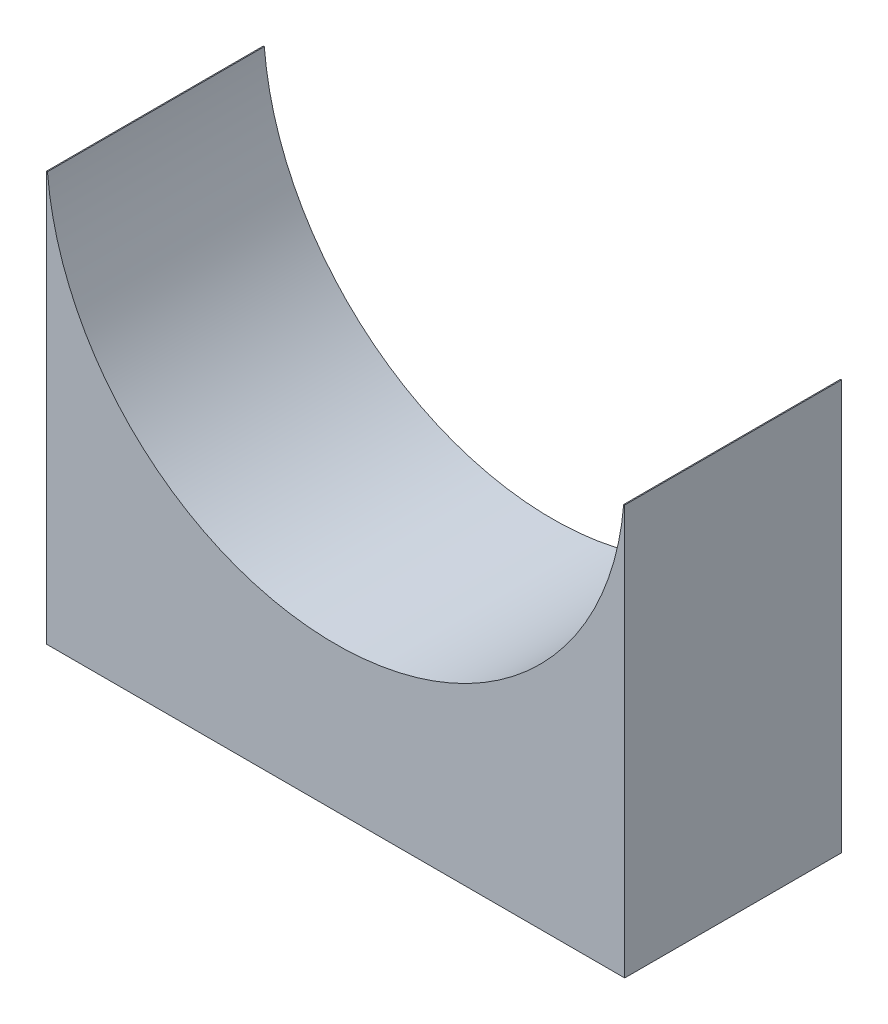
ISO-10303-21;
HEADER;
FILE_DESCRIPTION(('STEP AP214'),'2;1');
FILE_NAME('part.step','',(''),(''),'','','');
FILE_SCHEMA(('AUTOMOTIVE_DESIGN { 1 0 10303 214 1 1 1 1 }'));
ENDSEC;
DATA;
#1=APPLICATION_CONTEXT('core data for automotive mechanical design processes');
#2=APPLICATION_PROTOCOL_DEFINITION('international standard','automotive_design',2000,#1);
#3=PRODUCT_CONTEXT('',#1,'mechanical');
#4=PRODUCT('Part','Part','',(#3));
#5=PRODUCT_RELATED_PRODUCT_CATEGORY('part','',(#4));
#6=PRODUCT_DEFINITION_FORMATION('','',#4);
#7=PRODUCT_DEFINITION_CONTEXT('part definition',#1,'design');
#8=PRODUCT_DEFINITION('design','',#6,#7);
#9=PRODUCT_DEFINITION_SHAPE('','',#8);
#10=(LENGTH_UNIT() NAMED_UNIT(*) SI_UNIT(.MILLI.,.METRE.));
#11=(NAMED_UNIT(*) PLANE_ANGLE_UNIT() SI_UNIT($,.RADIAN.));
#12=(NAMED_UNIT(*) SI_UNIT($,.STERADIAN.) SOLID_ANGLE_UNIT());
#13=UNCERTAINTY_MEASURE_WITH_UNIT(LENGTH_MEASURE(1.E-05),#10,'distance_accuracy_value','');
#14=(GEOMETRIC_REPRESENTATION_CONTEXT(3) GLOBAL_UNCERTAINTY_ASSIGNED_CONTEXT((#13)) GLOBAL_UNIT_ASSIGNED_CONTEXT((#10,
#11,#12)) REPRESENTATION_CONTEXT('',''));
#15=CARTESIAN_POINT('',(0.,0.,0.));
#16=DIRECTION('',(0.,0.,1.));
#17=DIRECTION('',(1.,0.,0.));
#18=AXIS2_PLACEMENT_3D('',#15,#16,#17);
#19=CARTESIAN_POINT('',(0.,0.,4.5));
#20=DIRECTION('',(0.,0.,-1.));
#21=DIRECTION('',(-1.,0.,0.));
#22=AXIS2_PLACEMENT_3D('',#19,#20,#21);
#23=CYLINDRICAL_SURFACE('',#22,6.);
#24=CARTESIAN_POINT('',(0.,0.,0.));
#25=DIRECTION('',(0.,0.,1.));
#26=DIRECTION('',(1.,0.,0.));
#27=AXIS2_PLACEMENT_3D('',#24,#25,#26);
#28=CIRCLE('',#27,6.);
#29=CARTESIAN_POINT('',(-5.9791303715507,-0.5,0.));
#30=VERTEX_POINT('',#29);
#31=CARTESIAN_POINT('',(5.9791303715507,-0.5,0.));
#32=VERTEX_POINT('',#31);
#33=EDGE_CURVE('E117',#30,#32,#28,.T.);
#34=ORIENTED_EDGE('',*,*,#33,.F.);
#35=DIRECTION('',(0.,0.,-1.));
#36=VECTOR('',#35,1.);
#37=CARTESIAN_POINT('',(-5.9791303715507,-0.5,4.5));
#38=LINE('',#37,#36);
#39=CARTESIAN_POINT('',(-5.9791303715507,-0.5,4.5));
#40=VERTEX_POINT('',#39);
#41=EDGE_CURVE('E11',#40,#30,#38,.T.);
#42=ORIENTED_EDGE('',*,*,#41,.F.);
#43=CARTESIAN_POINT('',(0.,0.,4.5));
#44=DIRECTION('',(0.,0.,1.));
#45=DIRECTION('',(1.,0.,0.));
#46=AXIS2_PLACEMENT_3D('',#43,#44,#45);
#47=CIRCLE('',#46,6.);
#48=CARTESIAN_POINT('',(5.9791303715507,-0.5,4.5));
#49=VERTEX_POINT('',#48);
#50=EDGE_CURVE('E130',#40,#49,#47,.T.);
#51=ORIENTED_EDGE('',*,*,#50,.T.);
#52=DIRECTION('',(0.,0.,-1.));
#53=VECTOR('',#52,1.);
#54=CARTESIAN_POINT('',(5.9791303715507,-0.5,4.5));
#55=LINE('',#54,#53);
#56=EDGE_CURVE('E51',#49,#32,#55,.T.);
#57=ORIENTED_EDGE('',*,*,#56,.T.);
#58=EDGE_LOOP('',(#34,#42,#51,#57));
#59=FACE_BOUND('',#58,.T.);
#60=ADVANCED_FACE('F35',(#59),#23,.F.);
#61=CARTESIAN_POINT('',(0.,-0.499999999999627,4.5));
#62=DIRECTION('',(0.,1.,0.));
#63=DIRECTION('',(-1.,0.,0.));
#64=AXIS2_PLACEMENT_3D('',#61,#62,#63);
#65=PLANE('',#64);
#66=DIRECTION('',(1.,0.,0.));
#67=VECTOR('',#66,1.);
#68=CARTESIAN_POINT('',(0.,-0.499999999999627,0.));
#69=LINE('',#68,#67);
#70=CARTESIAN_POINT('',(-6.,-0.500000000000001,0.));
#71=VERTEX_POINT('',#70);
#72=EDGE_CURVE('E119',#71,#30,#69,.T.);
#73=ORIENTED_EDGE('',*,*,#72,.F.);
#74=DIRECTION('',(0.,0.,-1.));
#75=VECTOR('',#74,1.);
#76=CARTESIAN_POINT('',(-6.,-0.500000000000001,4.5));
#77=LINE('',#76,#75);
#78=CARTESIAN_POINT('',(-6.,-0.500000000000001,4.5));
#79=VERTEX_POINT('',#78);
#80=EDGE_CURVE('E43',#79,#71,#77,.T.);
#81=ORIENTED_EDGE('',*,*,#80,.F.);
#82=DIRECTION('',(1.,0.,0.));
#83=VECTOR('',#82,1.);
#84=CARTESIAN_POINT('',(0.,-0.499999999999627,4.5));
#85=LINE('',#84,#83);
#86=EDGE_CURVE('E142',#79,#40,#85,.T.);
#87=ORIENTED_EDGE('',*,*,#86,.T.);
#88=ORIENTED_EDGE('',*,*,#41,.T.);
#89=EDGE_LOOP('',(#73,#81,#87,#88));
#90=FACE_BOUND('',#89,.T.);
#91=ADVANCED_FACE('F141',(#90),#65,.T.);
#92=CARTESIAN_POINT('',(-6.,0.,4.5));
#93=DIRECTION('',(1.,0.,0.));
#94=DIRECTION('',(0.,1.,0.));
#95=AXIS2_PLACEMENT_3D('',#92,#93,#94);
#96=PLANE('',#95);
#97=DIRECTION('',(0.,-1.,0.));
#98=VECTOR('',#97,1.);
#99=CARTESIAN_POINT('',(-6.,0.,0.));
#100=LINE('',#99,#98);
#101=CARTESIAN_POINT('',(-6.,-9.,0.));
#102=VERTEX_POINT('',#101);
#103=EDGE_CURVE('E122',#71,#102,#100,.T.);
#104=ORIENTED_EDGE('',*,*,#103,.T.);
#105=DIRECTION('',(0.,0.,-1.));
#106=VECTOR('',#105,1.);
#107=CARTESIAN_POINT('',(-6.,-9.,4.5));
#108=LINE('',#107,#106);
#109=CARTESIAN_POINT('',(-6.,-9.,4.5));
#110=VERTEX_POINT('',#109);
#111=EDGE_CURVE('E109',#110,#102,#108,.T.);
#112=ORIENTED_EDGE('',*,*,#111,.F.);
#113=DIRECTION('',(0.,-1.,0.));
#114=VECTOR('',#113,1.);
#115=CARTESIAN_POINT('',(-6.,0.,4.5));
#116=LINE('',#115,#114);
#117=EDGE_CURVE('E97',#79,#110,#116,.T.);
#118=ORIENTED_EDGE('',*,*,#117,.F.);
#119=ORIENTED_EDGE('',*,*,#80,.T.);
#120=EDGE_LOOP('',(#104,#112,#118,#119));
#121=FACE_BOUND('',#120,.T.);
#122=ADVANCED_FACE('F135',(#121),#96,.F.);
#123=CARTESIAN_POINT('',(0.,-9.,4.5));
#124=DIRECTION('',(0.,1.,0.));
#125=DIRECTION('',(0.,0.,1.));
#126=AXIS2_PLACEMENT_3D('',#123,#124,#125);
#127=PLANE('',#126);
#128=DIRECTION('',(1.,0.,0.));
#129=VECTOR('',#128,1.);
#130=CARTESIAN_POINT('',(0.,-9.,0.));
#131=LINE('',#130,#129);
#132=CARTESIAN_POINT('',(6.,-9.,0.));
#133=VERTEX_POINT('',#132);
#134=EDGE_CURVE('E106',#102,#133,#131,.T.);
#135=ORIENTED_EDGE('',*,*,#134,.T.);
#136=DIRECTION('',(0.,0.,-1.));
#137=VECTOR('',#136,1.);
#138=CARTESIAN_POINT('',(6.,-9.,4.5));
#139=LINE('',#138,#137);
#140=CARTESIAN_POINT('',(6.,-9.,4.5));
#141=VERTEX_POINT('',#140);
#142=EDGE_CURVE('E103',#141,#133,#139,.T.);
#143=ORIENTED_EDGE('',*,*,#142,.F.);
#144=DIRECTION('',(1.,0.,0.));
#145=VECTOR('',#144,1.);
#146=CARTESIAN_POINT('',(0.,-9.,4.5));
#147=LINE('',#146,#145);
#148=EDGE_CURVE('E89',#110,#141,#147,.T.);
#149=ORIENTED_EDGE('',*,*,#148,.F.);
#150=ORIENTED_EDGE('',*,*,#111,.T.);
#151=EDGE_LOOP('',(#135,#143,#149,#150));
#152=FACE_BOUND('',#151,.T.);
#153=ADVANCED_FACE('F104',(#152),#127,.F.);
#154=CARTESIAN_POINT('',(6.,0.,4.5));
#155=DIRECTION('',(1.,0.,0.));
#156=DIRECTION('',(0.,1.,0.));
#157=AXIS2_PLACEMENT_3D('',#154,#155,#156);
#158=PLANE('',#157);
#159=DIRECTION('',(0.,-1.,0.));
#160=VECTOR('',#159,1.);
#161=CARTESIAN_POINT('',(6.,0.,0.));
#162=LINE('',#161,#160);
#163=CARTESIAN_POINT('',(6.,-0.499999999999999,0.));
#164=VERTEX_POINT('',#163);
#165=EDGE_CURVE('E125',#164,#133,#162,.T.);
#166=ORIENTED_EDGE('',*,*,#165,.F.);
#167=DIRECTION('',(0.,0.,-1.));
#168=VECTOR('',#167,1.);
#169=CARTESIAN_POINT('',(6.,-0.499999999999999,4.5));
#170=LINE('',#169,#168);
#171=CARTESIAN_POINT('',(6.,-0.499999999999999,4.5));
#172=VERTEX_POINT('',#171);
#173=EDGE_CURVE('E70',#172,#164,#170,.T.);
#174=ORIENTED_EDGE('',*,*,#173,.F.);
#175=DIRECTION('',(0.,-1.,0.));
#176=VECTOR('',#175,1.);
#177=CARTESIAN_POINT('',(6.,0.,4.5));
#178=LINE('',#177,#176);
#179=EDGE_CURVE('E94',#172,#141,#178,.T.);
#180=ORIENTED_EDGE('',*,*,#179,.T.);
#181=ORIENTED_EDGE('',*,*,#142,.T.);
#182=EDGE_LOOP('',(#166,#174,#180,#181));
#183=FACE_BOUND('',#182,.T.);
#184=ADVANCED_FACE('F111',(#183),#158,.T.);
#185=CARTESIAN_POINT('',(0.,-0.500000000000466,4.5));
#186=DIRECTION('',(0.,1.,0.));
#187=DIRECTION('',(-1.,0.,0.));
#188=AXIS2_PLACEMENT_3D('',#185,#186,#187);
#189=PLANE('',#188);
#190=DIRECTION('',(1.,0.,0.));
#191=VECTOR('',#190,1.);
#192=CARTESIAN_POINT('',(0.,-0.500000000000466,0.));
#193=LINE('',#192,#191);
#194=EDGE_CURVE('E127',#32,#164,#193,.T.);
#195=ORIENTED_EDGE('',*,*,#194,.F.);
#196=ORIENTED_EDGE('',*,*,#56,.F.);
#197=DIRECTION('',(1.,0.,0.));
#198=VECTOR('',#197,1.);
#199=CARTESIAN_POINT('',(0.,-0.500000000000466,4.5));
#200=LINE('',#199,#198);
#201=EDGE_CURVE('E112',#49,#172,#200,.T.);
#202=ORIENTED_EDGE('',*,*,#201,.T.);
#203=ORIENTED_EDGE('',*,*,#173,.T.);
#204=EDGE_LOOP('',(#195,#196,#202,#203));
#205=FACE_BOUND('',#204,.T.);
#206=ADVANCED_FACE('F143',(#205),#189,.T.);
#207=CARTESIAN_POINT('',(0.,0.,4.5));
#208=DIRECTION('',(0.,0.,1.));
#209=DIRECTION('',(1.,0.,0.));
#210=AXIS2_PLACEMENT_3D('',#207,#208,#209);
#211=PLANE('',#210);
#212=ORIENTED_EDGE('',*,*,#50,.F.);
#213=ORIENTED_EDGE('',*,*,#86,.F.);
#214=ORIENTED_EDGE('',*,*,#117,.T.);
#215=ORIENTED_EDGE('',*,*,#148,.T.);
#216=ORIENTED_EDGE('',*,*,#179,.F.);
#217=ORIENTED_EDGE('',*,*,#201,.F.);
#218=EDGE_LOOP('',(#212,#213,#214,#215,#216,#217));
#219=FACE_BOUND('',#218,.T.);
#220=ADVANCED_FACE('F91',(#219),#211,.T.);
#221=CARTESIAN_POINT('',(0.,0.,0.));
#222=DIRECTION('',(0.,0.,1.));
#223=DIRECTION('',(1.,0.,0.));
#224=AXIS2_PLACEMENT_3D('',#221,#222,#223);
#225=PLANE('',#224);
#226=ORIENTED_EDGE('',*,*,#33,.T.);
#227=ORIENTED_EDGE('',*,*,#194,.T.);
#228=ORIENTED_EDGE('',*,*,#165,.T.);
#229=ORIENTED_EDGE('',*,*,#134,.F.);
#230=ORIENTED_EDGE('',*,*,#103,.F.);
#231=ORIENTED_EDGE('',*,*,#72,.T.);
#232=EDGE_LOOP('',(#226,#227,#228,#229,#230,#231));
#233=FACE_BOUND('',#232,.T.);
#234=ADVANCED_FACE('F140',(#233),#225,.F.);
#235=CLOSED_SHELL('',(#60,#91,#122,#153,#184,#206,#220,#234));
#236=MANIFOLD_SOLID_BREP('B2',#235);
#237=ADVANCED_BREP_SHAPE_REPRESENTATION('',(#18,#236),#14);
#238=SHAPE_DEFINITION_REPRESENTATION(#9,#237);
ENDSEC;
END-ISO-10303-21;
